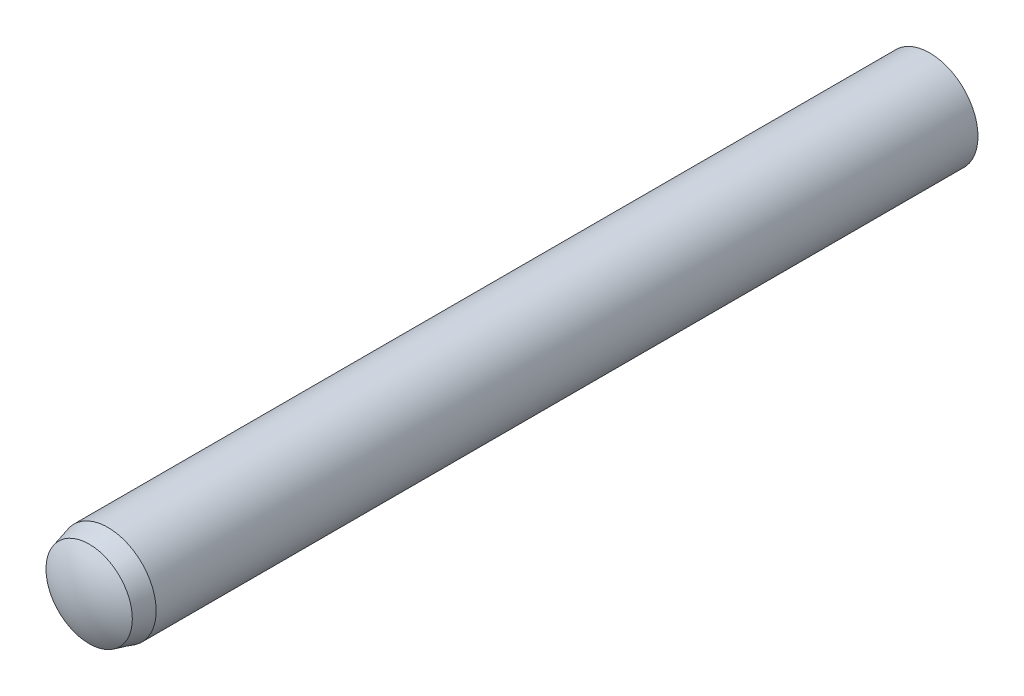
ISO-10303-21;
HEADER;
FILE_DESCRIPTION(('STEP AP214'),'2;1');
FILE_NAME('part.step','',(''),(''),'','','');
FILE_SCHEMA(('AUTOMOTIVE_DESIGN { 1 0 10303 214 1 1 1 1 }'));
ENDSEC;
DATA;
#1=APPLICATION_CONTEXT('core data for automotive mechanical design processes');
#2=APPLICATION_PROTOCOL_DEFINITION('international standard','automotive_design',2000,#1);
#3=PRODUCT_CONTEXT('',#1,'mechanical');
#4=PRODUCT('Part','Part','',(#3));
#5=PRODUCT_RELATED_PRODUCT_CATEGORY('part','',(#4));
#6=PRODUCT_DEFINITION_FORMATION('','',#4);
#7=PRODUCT_DEFINITION_CONTEXT('part definition',#1,'design');
#8=PRODUCT_DEFINITION('design','',#6,#7);
#9=PRODUCT_DEFINITION_SHAPE('','',#8);
#10=(LENGTH_UNIT() NAMED_UNIT(*) SI_UNIT(.MILLI.,.METRE.));
#11=(NAMED_UNIT(*) PLANE_ANGLE_UNIT() SI_UNIT($,.RADIAN.));
#12=(NAMED_UNIT(*) SI_UNIT($,.STERADIAN.) SOLID_ANGLE_UNIT());
#13=UNCERTAINTY_MEASURE_WITH_UNIT(LENGTH_MEASURE(1.E-05),#10,'distance_accuracy_value','');
#14=(GEOMETRIC_REPRESENTATION_CONTEXT(3) GLOBAL_UNCERTAINTY_ASSIGNED_CONTEXT((#13)) GLOBAL_UNIT_ASSIGNED_CONTEXT((#10,
#11,#12)) REPRESENTATION_CONTEXT('',''));
#15=CARTESIAN_POINT('',(0.,0.,0.));
#16=DIRECTION('',(0.,0.,1.));
#17=DIRECTION('',(1.,0.,0.));
#18=AXIS2_PLACEMENT_3D('',#15,#16,#17);
#19=CARTESIAN_POINT('',(0.,0.,-35.9166666666667));
#20=DIRECTION('',(0.,0.,1.));
#21=DIRECTION('',(0.,1.,0.));
#22=AXIS2_PLACEMENT_3D('',#19,#20,#21);
#23=SPHERICAL_SURFACE('',#22,9.08333333333328);
#24=CARTESIAN_POINT('',(0.,0.,-43.5));
#25=DIRECTION('',(0.,0.,1.));
#26=DIRECTION('',(0.,-1.,0.));
#27=AXIS2_PLACEMENT_3D('',#24,#25,#26);
#28=CIRCLE('',#27,4.99999999999999);
#29=CARTESIAN_POINT('',(0.,-4.99999999999997,-43.5));
#30=VERTEX_POINT('',#29);
#31=EDGE_CURVE('E10',#30,#30,#28,.T.);
#32=ORIENTED_EDGE('',*,*,#31,.F.);
#33=EDGE_LOOP('',(#32));
#34=FACE_BOUND('',#33,.T.);
#35=ADVANCED_FACE('F37',(#34),#23,.T.);
#36=CARTESIAN_POINT('',(0.,0.,45.));
#37=DIRECTION('',(0.,0.,1.));
#38=DIRECTION('',(0.,-1.,0.));
#39=AXIS2_PLACEMENT_3D('',#36,#37,#38);
#40=CYLINDRICAL_SURFACE('',#39,4.99999999999999);
#41=CARTESIAN_POINT('',(0.,0.,41.75));
#42=DIRECTION('',(0.,0.,1.));
#43=DIRECTION('',(0.,-1.,0.));
#44=AXIS2_PLACEMENT_3D('',#41,#42,#43);
#45=CIRCLE('',#44,5.);
#46=CARTESIAN_POINT('',(0.,-5.,41.75));
#47=VERTEX_POINT('',#46);
#48=EDGE_CURVE('E43',#47,#47,#45,.T.);
#49=ORIENTED_EDGE('',*,*,#48,.F.);
#50=EDGE_LOOP('',(#49));
#51=FACE_BOUND('',#50,.T.);
#52=ORIENTED_EDGE('',*,*,#31,.T.);
#53=EDGE_LOOP('',(#52));
#54=FACE_BOUND('',#53,.T.);
#55=ADVANCED_FACE('F58',(#51,#54),#40,.T.);
#56=CARTESIAN_POINT('',(0.,0.,41.75));
#57=DIRECTION('',(0.,0.,-1.));
#58=DIRECTION('',(0.,1.,0.));
#59=AXIS2_PLACEMENT_3D('',#56,#57,#58);
#60=CONICAL_SURFACE('',#59,5.,0.26179938779915);
#61=CARTESIAN_POINT('',(0.,0.,43.7));
#62=DIRECTION('',(0.,0.,1.));
#63=DIRECTION('',(0.,-1.,0.));
#64=AXIS2_PLACEMENT_3D('',#61,#62,#63);
#65=CIRCLE('',#64,4.47749907475931);
#66=CARTESIAN_POINT('',(0.,-4.47749907475931,43.7));
#67=VERTEX_POINT('',#66);
#68=EDGE_CURVE('E47',#67,#67,#65,.T.);
#69=ORIENTED_EDGE('',*,*,#68,.F.);
#70=EDGE_LOOP('',(#69));
#71=FACE_BOUND('',#70,.T.);
#72=ORIENTED_EDGE('',*,*,#48,.T.);
#73=EDGE_LOOP('',(#72));
#74=FACE_BOUND('',#73,.T.);
#75=ADVANCED_FACE('F56',(#71,#74),#60,.T.);
#76=CARTESIAN_POINT('',(0.,0.,36.6392315521268));
#77=DIRECTION('',(0.,0.,1.));
#78=DIRECTION('',(0.,1.,0.));
#79=AXIS2_PLACEMENT_3D('',#76,#77,#78);
#80=SPHERICAL_SURFACE('',#79,8.36076844787324);
#81=ORIENTED_EDGE('',*,*,#68,.T.);
#82=EDGE_LOOP('',(#81));
#83=FACE_BOUND('',#82,.T.);
#84=ADVANCED_FACE('F54',(#83),#80,.T.);
#85=CLOSED_SHELL('',(#35,#55,#75,#84));
#86=MANIFOLD_SOLID_BREP('B2',#85);
#87=ADVANCED_BREP_SHAPE_REPRESENTATION('',(#18,#86),#14);
#88=SHAPE_DEFINITION_REPRESENTATION(#9,#87);
ENDSEC;
END-ISO-10303-21;
